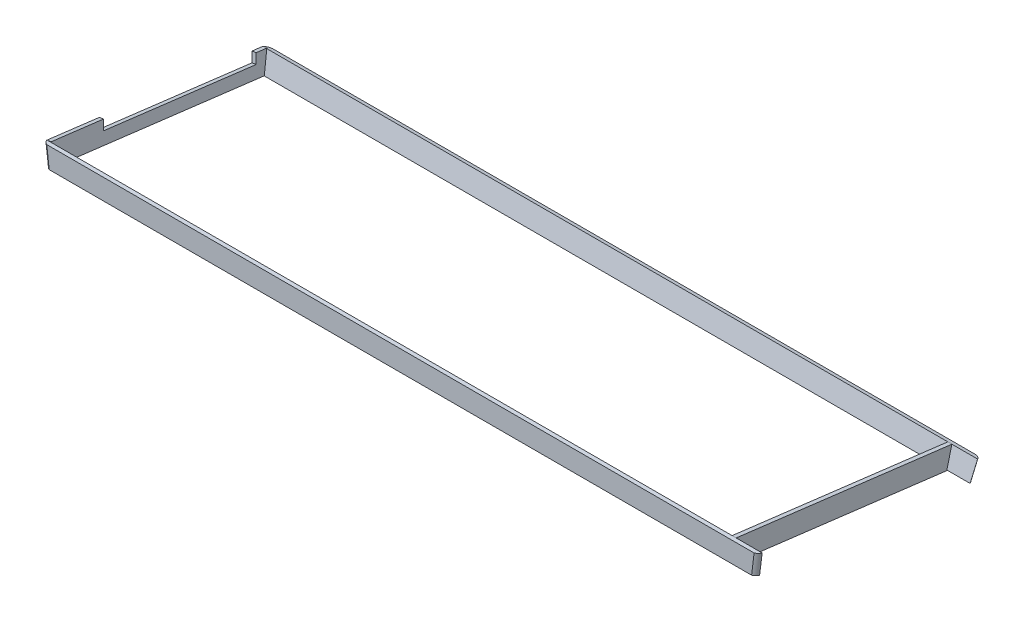
ISO-10303-21;
HEADER;
FILE_DESCRIPTION(('STEP AP214'),'2;1');
FILE_NAME('part.step','',(''),(''),'','','');
FILE_SCHEMA(('AUTOMOTIVE_DESIGN { 1 0 10303 214 1 1 1 1 }'));
ENDSEC;
DATA;
#1=APPLICATION_CONTEXT('core data for automotive mechanical design processes');
#2=APPLICATION_PROTOCOL_DEFINITION('international standard','automotive_design',2000,#1);
#3=PRODUCT_CONTEXT('',#1,'mechanical');
#4=PRODUCT('Part','Part','',(#3));
#5=PRODUCT_RELATED_PRODUCT_CATEGORY('part','',(#4));
#6=PRODUCT_DEFINITION_FORMATION('','',#4);
#7=PRODUCT_DEFINITION_CONTEXT('part definition',#1,'design');
#8=PRODUCT_DEFINITION('design','',#6,#7);
#9=PRODUCT_DEFINITION_SHAPE('','',#8);
#10=(LENGTH_UNIT() NAMED_UNIT(*) SI_UNIT(.MILLI.,.METRE.));
#11=(NAMED_UNIT(*) PLANE_ANGLE_UNIT() SI_UNIT($,.RADIAN.));
#12=(NAMED_UNIT(*) SI_UNIT($,.STERADIAN.) SOLID_ANGLE_UNIT());
#13=UNCERTAINTY_MEASURE_WITH_UNIT(LENGTH_MEASURE(1.E-05),#10,'distance_accuracy_value','');
#14=(GEOMETRIC_REPRESENTATION_CONTEXT(3) GLOBAL_UNCERTAINTY_ASSIGNED_CONTEXT((#13)) GLOBAL_UNIT_ASSIGNED_CONTEXT((#10,
#11,#12)) REPRESENTATION_CONTEXT('',''));
#15=CARTESIAN_POINT('',(0.,0.,0.));
#16=DIRECTION('',(0.,0.,1.));
#17=DIRECTION('',(1.,0.,0.));
#18=AXIS2_PLACEMENT_3D('',#15,#16,#17);
#19=CARTESIAN_POINT('',(2.22044604925031E-13,-68.0158170578648,-549.752872760666));
#20=DIRECTION('',(0.,0.243710985890071,0.969847903207761));
#21=DIRECTION('',(1.,0.,0.));
#22=AXIS2_PLACEMENT_3D('',#19,#20,#21);
#23=PLANE('',#22);
#24=DIRECTION('',(1.,0.,0.));
#25=VECTOR('',#24,1.);
#26=CARTESIAN_POINT('',(-881.492544306132,-178.869432394512,-521.896707073431));
#27=LINE('',#26,#25);
#28=CARTESIAN_POINT('',(-881.456949016877,-178.869432394512,-521.896707073431));
#29=VERTEX_POINT('',#28);
#30=CARTESIAN_POINT('',(876.247641689883,-178.869432394512,-521.896707073431));
#31=VERTEX_POINT('',#30);
#32=EDGE_CURVE('E49',#29,#31,#27,.T.);
#33=ORIENTED_EDGE('',*,*,#32,.T.);
#34=CARTESIAN_POINT('',(-296.789427030071,-9380.64778403381,1790.39831011703));
#35=DIRECTION('',(0.,0.243710985890071,0.969847903207761));
#36=DIRECTION('',(0.120974341833723,0.96272498568484,-0.241921083322686));
#37=AXIS2_PLACEMENT_3D('',#34,#35,#36);
#38=ELLIPSE('',#37,20533.7669945915,18.796);
#39=CARTESIAN_POINT('',(882.413697299898,-129.601158911557,-534.277225156647));
#40=VERTEX_POINT('',#39);
#41=EDGE_CURVE('E63',#31,#40,#38,.T.);
#42=ORIENTED_EDGE('',*,*,#41,.T.);
#43=DIRECTION('',(-1.,0.,0.));
#44=VECTOR('',#43,1.);
#45=CARTESIAN_POINT('',(887.73,-129.601158911557,-534.277225156647));
#46=LINE('',#45,#44);
#47=CARTESIAN_POINT('',(-887.623004626891,-129.601158911557,-534.277225156647));
#48=VERTEX_POINT('',#47);
#49=EDGE_CURVE('E109',#40,#48,#46,.T.);
#50=ORIENTED_EDGE('',*,*,#49,.T.);
#51=CARTESIAN_POINT('',(291.580119703276,-9380.64778403405,1790.39831011709));
#52=DIRECTION('',(0.,0.243710985890071,0.969847903207761));
#53=DIRECTION('',(-0.120974341833741,0.962724985684838,-0.241921083322685));
#54=AXIS2_PLACEMENT_3D('',#51,#52,#53);
#55=ELLIPSE('',#54,20533.7669945934,18.796);
#56=EDGE_CURVE('E81',#48,#29,#55,.T.);
#57=ORIENTED_EDGE('',*,*,#56,.T.);
#58=EDGE_LOOP('',(#33,#42,#50,#57));
#59=FACE_BOUND('',#58,.T.);
#60=ADVANCED_FACE('F45',(#59),#23,.T.);
#61=CARTESIAN_POINT('',(2.22044604925031E-13,-70.4529269167654,-559.451351792744));
#62=DIRECTION('',(0.,0.243710985890071,0.969847903207761));
#63=DIRECTION('',(1.,0.,0.));
#64=AXIS2_PLACEMENT_3D('',#61,#62,#63);
#65=PLANE('',#64);
#66=CARTESIAN_POINT('',(-1618.37801334505,-19900.4089276958,4423.57548274722));
#67=DIRECTION('',(0.,0.243710985890071,0.969847903207761));
#68=DIRECTION('',(0.120974341833723,0.96272498568484,-0.241921083322686));
#69=AXIS2_PLACEMENT_3D('',#66,#67,#68);
#70=ELLIPSE('',#69,20533.7669945915,18.796);
#71=CARTESIAN_POINT('',(860.823886031654,-181.306542253412,-531.595186105509));
#72=VERTEX_POINT('',#71);
#73=CARTESIAN_POINT('',(865.678837336204,-132.038268767054,-543.97570418958));
#74=VERTEX_POINT('',#73);
#75=EDGE_CURVE('E55',#72,#74,#70,.T.);
#76=ORIENTED_EDGE('',*,*,#75,.F.);
#77=DIRECTION('',(1.,0.,0.));
#78=VECTOR('',#77,1.);
#79=CARTESIAN_POINT('',(-881.492544306132,-181.306542253413,-531.595186105509));
#80=LINE('',#79,#78);
#81=CARTESIAN_POINT('',(-866.033193358654,-181.306542253413,-531.595186105509));
#82=VERTEX_POINT('',#81);
#83=EDGE_CURVE('E98',#82,#72,#80,.T.);
#84=ORIENTED_EDGE('',*,*,#83,.F.);
#85=CARTESIAN_POINT('',(1613.16870601856,-19900.408927697,4423.57548274752));
#86=DIRECTION('',(0.,0.243710985890071,0.969847903207761));
#87=DIRECTION('',(-0.120974341833741,0.962724985684838,-0.241921083322685));
#88=AXIS2_PLACEMENT_3D('',#85,#86,#87);
#89=ELLIPSE('',#88,20533.7669945934,18.796);
#90=CARTESIAN_POINT('',(-870.888144663335,-132.038268765971,-543.975704189851));
#91=VERTEX_POINT('',#90);
#92=EDGE_CURVE('E105',#91,#82,#89,.T.);
#93=ORIENTED_EDGE('',*,*,#92,.F.);
#94=DIRECTION('',(-1.,0.,0.));
#95=VECTOR('',#94,1.);
#96=CARTESIAN_POINT('',(887.73,-132.038268770458,-543.975704188724));
#97=LINE('',#96,#95);
#98=EDGE_CURVE('E100',#74,#91,#97,.T.);
#99=ORIENTED_EDGE('',*,*,#98,.F.);
#100=EDGE_LOOP('',(#76,#84,#93,#99));
#101=FACE_BOUND('',#100,.T.);
#102=ADVANCED_FACE('F96',(#101),#65,.F.);
#103=CARTESIAN_POINT('',(887.73,-129.601158911557,-534.277225156647));
#104=DIRECTION('',(0.,-0.969847903207761,0.243710985890071));
#105=DIRECTION('',(0.,-0.243710985890071,-0.969847903207761));
#106=AXIS2_PLACEMENT_3D('',#103,#104,#105);
#107=PLANE('',#106);
#108=CARTESIAN_POINT('',(865.680949648837,-127.457475132036,-525.746435249428));
#109=DIRECTION('',(0.,-0.969847903207761,0.243710985890071));
#110=DIRECTION('',(0.99997137412323,0.00184402326089202,0.00733829083047228));
#111=AXIS2_PLACEMENT_3D('',#108,#109,#110);
#112=ELLIPSE('',#111,18.935073979517,18.796);
#113=EDGE_CURVE('E12',#74,#40,#112,.T.);
#114=ORIENTED_EDGE('',*,*,#113,.F.);
#115=ORIENTED_EDGE('',*,*,#98,.T.);
#116=CARTESIAN_POINT('',(-870.890256975832,-127.457475132036,-525.746435249428));
#117=DIRECTION('',(0.,-0.969847903207761,0.243710985890071));
#118=DIRECTION('',(-0.99997137412323,0.00184402326089159,0.00733829083047056));
#119=AXIS2_PLACEMENT_3D('',#116,#117,#118);
#120=ELLIPSE('',#119,18.935073979517,18.796);
#121=EDGE_CURVE('E103',#48,#91,#120,.T.);
#122=ORIENTED_EDGE('',*,*,#121,.F.);
#123=ORIENTED_EDGE('',*,*,#49,.F.);
#124=EDGE_LOOP('',(#114,#115,#122,#123));
#125=FACE_BOUND('',#124,.T.);
#126=ADVANCED_FACE('F119',(#125),#107,.F.);
#127=CARTESIAN_POINT('',(-881.492544306132,-178.869432394512,-521.896707073431));
#128=DIRECTION('',(0.,0.969847903207761,-0.243710985890071));
#129=DIRECTION('',(-1.,0.,0.));
#130=AXIS2_PLACEMENT_3D('',#127,#128,#129);
#131=PLANE('',#130);
#132=CARTESIAN_POINT('',(859.48998437162,-176.737165225779,-513.41134957048));
#133=DIRECTION('',(0.,0.969847903207761,-0.243710985890071));
#134=DIRECTION('',(0.99997137412323,0.00184402326089225,0.00733829083047221));
#135=AXIS2_PLACEMENT_3D('',#132,#133,#134);
#136=ELLIPSE('',#135,18.935073979517,18.796);
#137=EDGE_CURVE('E83',#31,#72,#136,.T.);
#138=ORIENTED_EDGE('',*,*,#137,.F.);
#139=ORIENTED_EDGE('',*,*,#32,.F.);
#140=CARTESIAN_POINT('',(-864.699291698613,-176.73716522578,-513.411349570481));
#141=DIRECTION('',(0.,0.969847903207761,-0.243710985890071));
#142=DIRECTION('',(-0.99997137412323,0.00184402326089136,0.00733829083047063));
#143=AXIS2_PLACEMENT_3D('',#140,#141,#142);
#144=ELLIPSE('',#143,18.935073979517,18.796);
#145=EDGE_CURVE('E91',#82,#29,#144,.T.);
#146=ORIENTED_EDGE('',*,*,#145,.F.);
#147=ORIENTED_EDGE('',*,*,#83,.T.);
#148=EDGE_LOOP('',(#138,#139,#146,#147));
#149=FACE_BOUND('',#148,.T.);
#150=ADVANCED_FACE('F47',(#149),#131,.F.);
#151=CARTESIAN_POINT('',(-851.874778988612,-278.819471239961,-487.859362766299));
#152=DIRECTION('',(-0.120974291151364,0.962947668142679,-0.241033212024822));
#153=DIRECTION('',(0.,-0.242816543984105,-0.970072227191159));
#154=AXIS2_PLACEMENT_3D('',#151,#152,#153);
#155=CYLINDRICAL_SURFACE('',#154,18.796);
#156=ORIENTED_EDGE('',*,*,#121,.T.);
#157=ORIENTED_EDGE('',*,*,#92,.T.);
#158=ORIENTED_EDGE('',*,*,#145,.T.);
#159=ORIENTED_EDGE('',*,*,#56,.F.);
#160=EDGE_LOOP('',(#156,#157,#158,#159));
#161=FACE_BOUND('',#160,.T.);
#162=ADVANCED_FACE('F117',(#161),#155,.T.);
#163=CARTESIAN_POINT('',(864.433849686277,-137.384311565293,-523.261671694864));
#164=DIRECTION('',(0.120974291151346,0.962947668142681,-0.241033212024823));
#165=DIRECTION('',(0.992546151641323,-0.12094720057894,0.0149636738175255));
#166=AXIS2_PLACEMENT_3D('',#163,#164,#165);
#167=CYLINDRICAL_SURFACE('',#166,18.796);
#168=ORIENTED_EDGE('',*,*,#137,.T.);
#169=ORIENTED_EDGE('',*,*,#75,.T.);
#170=ORIENTED_EDGE('',*,*,#113,.T.);
#171=ORIENTED_EDGE('',*,*,#41,.F.);
#172=EDGE_LOOP('',(#168,#169,#170,#171));
#173=FACE_BOUND('',#172,.T.);
#174=ADVANCED_FACE('F85',(#173),#167,.T.);
#175=CLOSED_SHELL('',(#60,#102,#126,#150,#162,#174));
#176=MANIFOLD_SOLID_BREP('B2',#175);
#177=CARTESIAN_POINT('',(0.,0.,10.));
#178=DIRECTION('',(0.,0.,1.));
#179=DIRECTION('',(1.,0.,0.));
#180=AXIS2_PLACEMENT_3D('',#177,#178,#179);
#181=PLANE('',#180);
#182=DIRECTION('',(1.,0.,0.));
#183=VECTOR('',#182,1.);
#184=CARTESIAN_POINT('',(-881.492544306132,-114.3,10.));
#185=LINE('',#184,#183);
#186=CARTESIAN_POINT('',(-872.306440998005,-114.3,10.));
#187=VERTEX_POINT('',#186);
#188=CARTESIAN_POINT('',(867.097133671005,-114.3,10.));
#189=VERTEX_POINT('',#188);
#190=EDGE_CURVE('E182',#187,#189,#185,.T.);
#191=ORIENTED_EDGE('',*,*,#190,.T.);
#192=CARTESIAN_POINT('',(-1413.85249724018,-18768.0329043244,10.));
#193=DIRECTION('',(0.,0.,1.));
#194=DIRECTION('',(0.120974341833724,0.992655634456329,0.));
#195=AXIS2_PLACEMENT_3D('',#192,#193,#194);
#196=ELLIPSE('',#195,20533.7669943114,18.796);
#197=CARTESIAN_POINT('',(873.180039228705,-63.4999999999998,10.));
#198=VERTEX_POINT('',#197);
#199=EDGE_CURVE('E256',#189,#198,#196,.T.);
#200=ORIENTED_EDGE('',*,*,#199,.T.);
#201=DIRECTION('',(-1.,0.,0.));
#202=VECTOR('',#201,1.);
#203=CARTESIAN_POINT('',(887.73,-63.4999999999998,10.));
#204=LINE('',#203,#202);
#205=CARTESIAN_POINT('',(-878.389346555706,-63.4999999999998,10.));
#206=VERTEX_POINT('',#205);
#207=EDGE_CURVE('E257',#198,#206,#204,.T.);
#208=ORIENTED_EDGE('',*,*,#207,.T.);
#209=CARTESIAN_POINT('',(1408.64318991419,-18768.03290433,10.));
#210=DIRECTION('',(0.,0.,1.));
#211=DIRECTION('',(-0.120974341833741,0.992655634456327,0.));
#212=AXIS2_PLACEMENT_3D('',#209,#210,#211);
#213=ELLIPSE('',#212,20533.7669943213,18.796);
#214=EDGE_CURVE('E260',#206,#187,#213,.T.);
#215=ORIENTED_EDGE('',*,*,#214,.T.);
#216=EDGE_LOOP('',(#191,#200,#208,#215));
#217=FACE_BOUND('',#216,.T.);
#218=ADVANCED_FACE('F178',(#217),#181,.T.);
#219=CARTESIAN_POINT('',(0.,0.,0.));
#220=DIRECTION('',(0.,0.,1.));
#221=DIRECTION('',(1.,0.,0.));
#222=AXIS2_PLACEMENT_3D('',#219,#220,#221);
#223=PLANE('',#222);
#224=CARTESIAN_POINT('',(-92.2639109432348,-7923.73041228038,0.));
#225=DIRECTION('',(0.,0.,1.));
#226=DIRECTION('',(0.120974341833724,0.992655634456329,0.));
#227=AXIS2_PLACEMENT_3D('',#224,#225,#226);
#228=ELLIPSE('',#227,20533.7669943114,18.796);
#229=CARTESIAN_POINT('',(876.956014817047,-114.3,0.));
#230=VERTEX_POINT('',#229);
#231=CARTESIAN_POINT('',(883.127325743308,-63.4999999999998,0.));
#232=VERTEX_POINT('',#231);
#233=EDGE_CURVE('E215',#230,#232,#228,.T.);
#234=ORIENTED_EDGE('',*,*,#233,.F.);
#235=DIRECTION('',(1.,0.,0.));
#236=VECTOR('',#235,1.);
#237=CARTESIAN_POINT('',(-881.492544306132,-114.3,0.));
#238=LINE('',#237,#236);
#239=CARTESIAN_POINT('',(-881.492544306132,-114.3,0.));
#240=VERTEX_POINT('',#239);
#241=EDGE_CURVE('E232',#240,#230,#238,.T.);
#242=ORIENTED_EDGE('',*,*,#241,.F.);
#243=DIRECTION('',(0.121869343405147,-0.992546151641322,0.));
#244=VECTOR('',#243,1.);
#245=CARTESIAN_POINT('',(-881.492544306132,-114.3,0.));
#246=LINE('',#245,#244);
#247=CARTESIAN_POINT('',(-887.73,-63.4999999999998,0.));
#248=VERTEX_POINT('',#247);
#249=EDGE_CURVE('E242',#248,#240,#246,.T.);
#250=ORIENTED_EDGE('',*,*,#249,.F.);
#251=DIRECTION('',(-1.,0.,0.));
#252=VECTOR('',#251,1.);
#253=CARTESIAN_POINT('',(887.73,-63.4999999999998,0.));
#254=LINE('',#253,#252);
#255=EDGE_CURVE('E237',#232,#248,#254,.T.);
#256=ORIENTED_EDGE('',*,*,#255,.F.);
#257=EDGE_LOOP('',(#234,#242,#250,#256));
#258=FACE_BOUND('',#257,.T.);
#259=ADVANCED_FACE('F180',(#258),#223,.F.);
#260=CARTESIAN_POINT('',(887.73,-63.4999999999998,10.));
#261=DIRECTION('',(0.,-1.,0.));
#262=DIRECTION('',(0.,0.,-1.));
#263=AXIS2_PLACEMENT_3D('',#260,#261,#262);
#264=PLANE('',#263);
#265=CARTESIAN_POINT('',(865.657615697604,-63.4999999999998,-7.24825816879146));
#266=DIRECTION('',(0.,-1.,0.));
#267=DIRECTION('',(0.999971374123229,0.,-0.0075664347020817));
#268=AXIS2_PLACEMENT_3D('',#265,#266,#267);
#269=ELLIPSE('',#268,18.935073979517,18.796);
#270=EDGE_CURVE('E210',#232,#198,#269,.T.);
#271=ORIENTED_EDGE('',*,*,#270,.F.);
#272=ORIENTED_EDGE('',*,*,#255,.T.);
#273=DIRECTION('',(0.,0.,-1.));
#274=VECTOR('',#273,1.);
#275=CARTESIAN_POINT('',(-887.73,-63.4999999999998,10.));
#276=LINE('',#275,#274);
#277=CARTESIAN_POINT('',(-887.73,-63.4999999999998,1.29902125661314));
#278=VERTEX_POINT('',#277);
#279=EDGE_CURVE('E243',#278,#248,#276,.T.);
#280=ORIENTED_EDGE('',*,*,#279,.F.);
#281=CARTESIAN_POINT('',(-870.866923024597,-63.4999999999998,-7.24825816878839));
#282=DIRECTION('',(0.,-1.,0.));
#283=DIRECTION('',(-0.999971374123229,0.,-0.00756643470207701));
#284=AXIS2_PLACEMENT_3D('',#281,#282,#283);
#285=ELLIPSE('',#284,18.935073979517,18.796);
#286=EDGE_CURVE('E43',#206,#278,#285,.T.);
#287=ORIENTED_EDGE('',*,*,#286,.F.);
#288=ORIENTED_EDGE('',*,*,#207,.F.);
#289=EDGE_LOOP('',(#271,#272,#280,#287,#288));
#290=FACE_BOUND('',#289,.T.);
#291=ADVANCED_FACE('F269',(#290),#264,.F.);
#292=CARTESIAN_POINT('',(-881.492544306132,-114.3,10.));
#293=DIRECTION('',(0.,1.,0.));
#294=DIRECTION('',(-1.,0.,0.));
#295=AXIS2_PLACEMENT_3D('',#292,#293,#294);
#296=PLANE('',#295);
#297=CARTESIAN_POINT('',(859.466650420387,-114.3,-7.20141329330291));
#298=DIRECTION('',(0.,1.,0.));
#299=DIRECTION('',(0.999971374123229,0.,-0.00756643470208168));
#300=AXIS2_PLACEMENT_3D('',#297,#298,#299);
#301=ELLIPSE('',#300,18.935073979517,18.796);
#302=EDGE_CURVE('E219',#189,#230,#301,.T.);
#303=ORIENTED_EDGE('',*,*,#302,.F.);
#304=ORIENTED_EDGE('',*,*,#190,.F.);
#305=CARTESIAN_POINT('',(-864.675957747379,-114.3,-7.20141329329986));
#306=DIRECTION('',(0.,1.,0.));
#307=DIRECTION('',(-0.999971374123229,0.,-0.00756643470207702));
#308=AXIS2_PLACEMENT_3D('',#305,#306,#307);
#309=ELLIPSE('',#308,18.935073979517,18.796);
#310=CARTESIAN_POINT('',(-881.492544306132,-114.3,1.43563523381322));
#311=VERTEX_POINT('',#310);
#312=EDGE_CURVE('E188',#311,#187,#309,.T.);
#313=ORIENTED_EDGE('',*,*,#312,.F.);
#314=DIRECTION('',(0.,0.,-1.));
#315=VECTOR('',#314,1.);
#316=CARTESIAN_POINT('',(-881.492544306132,-114.3,10.));
#317=LINE('',#316,#315);
#318=EDGE_CURVE('E229',#311,#240,#317,.T.);
#319=ORIENTED_EDGE('',*,*,#318,.T.);
#320=ORIENTED_EDGE('',*,*,#241,.T.);
#321=EDGE_LOOP('',(#303,#304,#313,#319,#320));
#322=FACE_BOUND('',#321,.T.);
#323=ADVANCED_FACE('F231',(#322),#296,.F.);
#324=CARTESIAN_POINT('',(-881.492544306132,-114.3,10.));
#325=DIRECTION('',(0.992546151641322,0.121869343405147,0.));
#326=DIRECTION('',(-0.121869343405147,0.992546151641322,0.));
#327=AXIS2_PLACEMENT_3D('',#324,#325,#326);
#328=PLANE('',#327);
#329=CARTESIAN_POINT('',(1374.72972991579,-18489.7558197761,9.74338867367638));
#330=DIRECTION('',(0.992546151641322,0.121869343405147,0.));
#331=DIRECTION('',(-0.121869292347766,0.992545735812324,-0.00091537065000802));
#332=AXIS2_PLACEMENT_3D('',#329,#330,#331);
#333=ELLIPSE('',#332,20845.7041755421,18.796);
#334=EDGE_CURVE('E253',#278,#311,#333,.T.);
#335=ORIENTED_EDGE('',*,*,#334,.F.);
#336=ORIENTED_EDGE('',*,*,#279,.T.);
#337=ORIENTED_EDGE('',*,*,#249,.T.);
#338=ORIENTED_EDGE('',*,*,#318,.F.);
#339=EDGE_LOOP('',(#335,#336,#337,#338));
#340=FACE_BOUND('',#339,.T.);
#341=ADVANCED_FACE('F245',(#340),#328,.F.);
#342=CARTESIAN_POINT('',(872.87197063104,-4.30257048650858,-7.30284667695685));
#343=DIRECTION('',(0.120974291151346,0.992655218581801,-0.000915370277904057));
#344=DIRECTION('',(0.,-0.000922142826207298,-0.999999574826214));
#345=AXIS2_PLACEMENT_3D('',#342,#343,#344);
#346=CYLINDRICAL_SURFACE('',#345,18.796);
#347=ORIENTED_EDGE('',*,*,#302,.T.);
#348=ORIENTED_EDGE('',*,*,#233,.T.);
#349=ORIENTED_EDGE('',*,*,#270,.T.);
#350=ORIENTED_EDGE('',*,*,#199,.F.);
#351=EDGE_LOOP('',(#347,#348,#349,#350));
#352=FACE_BOUND('',#351,.T.);
#353=ADVANCED_FACE('F282',(#352),#346,.T.);
#354=CARTESIAN_POINT('',(-878.081277958032,-4.30257048652353,-7.30284667695375));
#355=DIRECTION('',(-0.120974291151363,0.992655218581799,-0.000915370277903618));
#356=DIRECTION('',(0.992546151641321,0.120947200578957,-0.0149636738175293));
#357=AXIS2_PLACEMENT_3D('',#354,#355,#356);
#358=CYLINDRICAL_SURFACE('',#357,18.796);
#359=ORIENTED_EDGE('',*,*,#334,.T.);
#360=ORIENTED_EDGE('',*,*,#312,.T.);
#361=ORIENTED_EDGE('',*,*,#214,.F.);
#362=ORIENTED_EDGE('',*,*,#286,.T.);
#363=EDGE_LOOP('',(#359,#360,#361,#362));
#364=FACE_BOUND('',#363,.T.);
#365=ADVANCED_FACE('F267',(#364),#358,.T.);
#366=CLOSED_SHELL('',(#218,#259,#291,#323,#341,#353,#365));
#367=MANIFOLD_SOLID_BREP('B6',#366);
#368=CARTESIAN_POINT('',(818.753886540204,-129.601158911558,-534.277225156647));
#369=DIRECTION('',(0.,-0.992433348695962,0.122784560902904));
#370=DIRECTION('',(0.,-0.122784560902904,-0.992433348695962));
#371=AXIS2_PLACEMENT_3D('',#368,#369,#370);
#372=PLANE('',#371);
#373=DIRECTION('',(0.,0.122784560902904,0.992433348695962));
#374=VECTOR('',#373,1.);
#375=CARTESIAN_POINT('',(808.753886540204,-129.601158911558,-534.277225156647));
#376=LINE('',#375,#374);
#377=CARTESIAN_POINT('',(808.753886540204,-129.601158911558,-534.277225156647));
#378=VERTEX_POINT('',#377);
#379=CARTESIAN_POINT('',(808.753886540204,-63.5000000000003,-4.44089209850063E-13));
#380=VERTEX_POINT('',#379);
#381=EDGE_CURVE('E400',#378,#380,#376,.T.);
#382=ORIENTED_EDGE('',*,*,#381,.T.);
#383=DIRECTION('',(-1.,0.,0.));
#384=VECTOR('',#383,1.);
#385=CARTESIAN_POINT('',(818.753886540204,-63.5000000000003,-4.44089209850063E-13));
#386=LINE('',#385,#384);
#387=CARTESIAN_POINT('',(818.753886540204,-63.5000000000003,-4.44089209850063E-13));
#388=VERTEX_POINT('',#387);
#389=EDGE_CURVE('E176',#388,#380,#386,.T.);
#390=ORIENTED_EDGE('',*,*,#389,.F.);
#391=DIRECTION('',(0.,0.122784560902904,0.992433348695962));
#392=VECTOR('',#391,1.);
#393=CARTESIAN_POINT('',(818.753886540204,-129.601158911558,-534.277225156647));
#394=LINE('',#393,#392);
#395=CARTESIAN_POINT('',(818.753886540204,-129.601158911558,-534.277225156647));
#396=VERTEX_POINT('',#395);
#397=EDGE_CURVE('E388',#396,#388,#394,.T.);
#398=ORIENTED_EDGE('',*,*,#397,.F.);
#399=DIRECTION('',(-1.,0.,0.));
#400=VECTOR('',#399,1.);
#401=CARTESIAN_POINT('',(818.753886540204,-129.601158911558,-534.277225156647));
#402=LINE('',#401,#400);
#403=EDGE_CURVE('E396',#396,#378,#402,.T.);
#404=ORIENTED_EDGE('',*,*,#403,.T.);
#405=EDGE_LOOP('',(#382,#390,#398,#404));
#406=FACE_BOUND('',#405,.T.);
#407=ADVANCED_FACE('F337',(#406),#372,.F.);
#408=CARTESIAN_POINT('',(818.753886540204,-63.5000000000003,-4.44089209850063E-13));
#409=DIRECTION('',(0.,-0.000922142826199165,-0.999999574826214));
#410=DIRECTION('',(0.,0.999999574826214,-0.000922142826199165));
#411=AXIS2_PLACEMENT_3D('',#408,#409,#410);
#412=PLANE('',#411);
#413=DIRECTION('',(0.,-0.999999574826214,0.000922142826199179));
#414=VECTOR('',#413,1.);
#415=CARTESIAN_POINT('',(808.753886540204,-63.5000000000003,-4.44089209850063E-13));
#416=LINE('',#415,#414);
#417=CARTESIAN_POINT('',(808.753886540204,-115.548043650694,0.04799575047576));
#418=VERTEX_POINT('',#417);
#419=EDGE_CURVE('E392',#380,#418,#416,.T.);
#420=ORIENTED_EDGE('',*,*,#419,.T.);
#421=DIRECTION('',(-1.,0.,0.));
#422=VECTOR('',#421,1.);
#423=CARTESIAN_POINT('',(818.753886540204,-115.548043650694,0.04799575047576));
#424=LINE('',#423,#422);
#425=CARTESIAN_POINT('',(818.753886540204,-115.548043650694,0.04799575047576));
#426=VERTEX_POINT('',#425);
#427=EDGE_CURVE('E345',#426,#418,#424,.T.);
#428=ORIENTED_EDGE('',*,*,#427,.F.);
#429=DIRECTION('',(0.,-0.999999574826214,0.000922142826199179));
#430=VECTOR('',#429,1.);
#431=CARTESIAN_POINT('',(818.753886540204,-63.5000000000003,-4.44089209850063E-13));
#432=LINE('',#431,#430);
#433=EDGE_CURVE('E383',#388,#426,#432,.T.);
#434=ORIENTED_EDGE('',*,*,#433,.F.);
#435=ORIENTED_EDGE('',*,*,#389,.T.);
#436=EDGE_LOOP('',(#420,#428,#434,#435));
#437=FACE_BOUND('',#436,.T.);
#438=ADVANCED_FACE('F391',(#437),#412,.F.);
#439=CARTESIAN_POINT('',(818.753886540204,-115.548043650694,0.04799575047576));
#440=DIRECTION('',(0.,0.992433348695962,-0.122784560902904));
#441=DIRECTION('',(1.,0.,0.));
#442=AXIS2_PLACEMENT_3D('',#439,#440,#441);
#443=PLANE('',#442);
#444=DIRECTION('',(0.,-0.122784560902904,-0.992433348695962));
#445=VECTOR('',#444,1.);
#446=CARTESIAN_POINT('',(808.753886540204,-115.548043650694,0.04799575047576));
#447=LINE('',#446,#445);
#448=CARTESIAN_POINT('',(808.753886540204,-180.091542003916,-521.639093702851));
#449=VERTEX_POINT('',#448);
#450=EDGE_CURVE('E370',#418,#449,#447,.T.);
#451=ORIENTED_EDGE('',*,*,#450,.T.);
#452=DIRECTION('',(-1.,0.,0.));
#453=VECTOR('',#452,1.);
#454=CARTESIAN_POINT('',(818.753886540204,-180.091542003916,-521.639093702851));
#455=LINE('',#454,#453);
#456=CARTESIAN_POINT('',(818.753886540204,-180.091542003916,-521.639093702851));
#457=VERTEX_POINT('',#456);
#458=EDGE_CURVE('E393',#457,#449,#455,.T.);
#459=ORIENTED_EDGE('',*,*,#458,.F.);
#460=DIRECTION('',(0.,-0.122784560902904,-0.992433348695962));
#461=VECTOR('',#460,1.);
#462=CARTESIAN_POINT('',(818.753886540204,-115.548043650694,0.04799575047576));
#463=LINE('',#462,#461);
#464=EDGE_CURVE('E386',#426,#457,#463,.T.);
#465=ORIENTED_EDGE('',*,*,#464,.F.);
#466=ORIENTED_EDGE('',*,*,#427,.T.);
#467=EDGE_LOOP('',(#451,#459,#465,#466));
#468=FACE_BOUND('',#467,.T.);
#469=ADVANCED_FACE('F394',(#468),#443,.F.);
#470=CARTESIAN_POINT('',(818.753886540204,-129.601158911558,-534.277225156647));
#471=DIRECTION('',(0.,0.242816543984096,0.970072227191161));
#472=DIRECTION('',(0.,-0.970072227191161,0.242816543984096));
#473=AXIS2_PLACEMENT_3D('',#470,#471,#472);
#474=PLANE('',#473);
#475=DIRECTION('',(0.,0.970072227191161,-0.242816543984096));
#476=VECTOR('',#475,1.);
#477=CARTESIAN_POINT('',(808.753886540204,-129.601158911558,-534.277225156647));
#478=LINE('',#477,#476);
#479=EDGE_CURVE('E376',#449,#378,#478,.T.);
#480=ORIENTED_EDGE('',*,*,#479,.T.);
#481=ORIENTED_EDGE('',*,*,#403,.F.);
#482=DIRECTION('',(0.,0.970072227191161,-0.242816543984096));
#483=VECTOR('',#482,1.);
#484=CARTESIAN_POINT('',(818.753886540204,-129.601158911558,-534.277225156647));
#485=LINE('',#484,#483);
#486=EDGE_CURVE('E353',#457,#396,#485,.T.);
#487=ORIENTED_EDGE('',*,*,#486,.F.);
#488=ORIENTED_EDGE('',*,*,#458,.T.);
#489=EDGE_LOOP('',(#480,#481,#487,#488));
#490=FACE_BOUND('',#489,.T.);
#491=ADVANCED_FACE('F407',(#490),#474,.F.);
#492=CARTESIAN_POINT('',(818.753886540204,-34.3846610713561,-274.829824287389));
#493=DIRECTION('',(1.,0.,0.));
#494=DIRECTION('',(0.,-0.122784560902904,-0.992433348695962));
#495=AXIS2_PLACEMENT_3D('',#492,#493,#494);
#496=PLANE('',#495);
#497=ORIENTED_EDGE('',*,*,#397,.T.);
#498=ORIENTED_EDGE('',*,*,#433,.T.);
#499=ORIENTED_EDGE('',*,*,#464,.T.);
#500=ORIENTED_EDGE('',*,*,#486,.T.);
#501=EDGE_LOOP('',(#497,#498,#499,#500));
#502=FACE_BOUND('',#501,.T.);
#503=ADVANCED_FACE('F384',(#502),#496,.T.);
#504=CARTESIAN_POINT('',(808.753886540204,-34.3846610713561,-274.829824287389));
#505=DIRECTION('',(1.,0.,0.));
#506=DIRECTION('',(0.,-0.122784560902904,-0.992433348695962));
#507=AXIS2_PLACEMENT_3D('',#504,#505,#506);
#508=PLANE('',#507);
#509=ORIENTED_EDGE('',*,*,#381,.F.);
#510=ORIENTED_EDGE('',*,*,#479,.F.);
#511=ORIENTED_EDGE('',*,*,#450,.F.);
#512=ORIENTED_EDGE('',*,*,#419,.F.);
#513=EDGE_LOOP('',(#509,#510,#511,#512));
#514=FACE_BOUND('',#513,.T.);
#515=ADVANCED_FACE('F410',(#514),#508,.F.);
#516=CLOSED_SHELL('',(#407,#438,#469,#491,#503,#515));
#517=MANIFOLD_SOLID_BREP('B37',#516);
#518=CARTESIAN_POINT('',(-887.73,-63.4999999999998,0.));
#519=DIRECTION('',(0.122784560902904,-0.984923951603881,0.121855492945033));
#520=DIRECTION('',(0.,0.122784560902904,0.992433348695962));
#521=AXIS2_PLACEMENT_3D('',#518,#519,#520);
#522=PLANE('',#521);
#523=DIRECTION('',(0.,-0.122784560902904,-0.992433348695962));
#524=VECTOR('',#523,1.);
#525=CARTESIAN_POINT('',(-887.73,-63.4999999999998,0.));
#526=LINE('',#525,#524);
#527=CARTESIAN_POINT('',(-887.73,-126.326494672277,-507.809027746925));
#528=VERTEX_POINT('',#527);
#529=CARTESIAN_POINT('',(-887.73,-129.575226370299,-534.067619660877));
#530=VERTEX_POINT('',#529);
#531=EDGE_CURVE('E575',#528,#530,#526,.T.);
#532=ORIENTED_EDGE('',*,*,#531,.F.);
#533=DIRECTION('',(-0.992433348695962,-0.121855492945033,0.015076048396119));
#534=VECTOR('',#533,1.);
#535=CARTESIAN_POINT('',(-877.80566651304,-125.107939742826,-507.959788230886));
#536=LINE('',#535,#534);
#537=CARTESIAN_POINT('',(-877.80566651304,-125.107939742826,-507.959788230886));
#538=VERTEX_POINT('',#537);
#539=EDGE_CURVE('E560',#538,#528,#536,.T.);
#540=ORIENTED_EDGE('',*,*,#539,.F.);
#541=DIRECTION('',(0.,-0.122784560902904,-0.992433348695962));
#542=VECTOR('',#541,1.);
#543=CARTESIAN_POINT('',(-877.80566651304,-62.2814450705495,-0.150760483961232));
#544=LINE('',#543,#542);
#545=CARTESIAN_POINT('',(-877.80566651304,-128.382603982107,-534.427985640608));
#546=VERTEX_POINT('',#545);
#547=EDGE_CURVE('E551',#538,#546,#544,.T.);
#548=ORIENTED_EDGE('',*,*,#547,.T.);
#549=DIRECTION('',(0.992433348695962,0.121855492945032,-0.015076048396119));
#550=VECTOR('',#549,1.);
#551=CARTESIAN_POINT('',(-887.73,-129.601158911557,-534.277225156647));
#552=LINE('',#551,#550);
#553=CARTESIAN_POINT('',(-887.625410980983,-129.588316994782,-534.278813967739));
#554=VERTEX_POINT('',#553);
#555=EDGE_CURVE('E468',#554,#546,#552,.T.);
#556=ORIENTED_EDGE('',*,*,#555,.F.);
#557=CARTESIAN_POINT('',(-871.011616781876,-126.491458789849,-525.988236574182));
#558=DIRECTION('',(0.122784560902904,-0.984923951603881,0.121855492945033));
#559=DIRECTION('',(0.00750918212892397,-0.121859034456755,-0.992519011356973));
#560=AXIS2_PLACEMENT_3D('',#557,#558,#559);
#561=ELLIPSE('',#560,18.935073979517,18.796);
#562=EDGE_CURVE('E569',#530,#554,#561,.T.);
#563=ORIENTED_EDGE('',*,*,#562,.F.);
#564=EDGE_LOOP('',(#532,#540,#548,#556,#563));
#565=FACE_BOUND('',#564,.T.);
#566=ADVANCED_FACE('F460',(#565),#522,.F.);
#567=CARTESIAN_POINT('',(-877.80566651304,-62.2814450705495,-0.150760483961232));
#568=VERTEX_POINT('',#567);
#569=CARTESIAN_POINT('',(-877.80566651304,-78.32702203882,-129.842682377725));
#570=VERTEX_POINT('',#569);
#571=EDGE_CURVE('E580',#568,#570,#544,.T.);
#572=ORIENTED_EDGE('',*,*,#571,.T.);
#573=DIRECTION('',(-0.992433348695962,-0.121855492945033,0.015076048396119));
#574=VECTOR('',#573,1.);
#575=CARTESIAN_POINT('',(-877.80566651304,-78.32702203882,-129.842682377725));
#576=LINE('',#575,#574);
#577=CARTESIAN_POINT('',(-887.73,-79.5455769682703,-129.691921893764));
#578=VERTEX_POINT('',#577);
#579=EDGE_CURVE('E562',#570,#578,#576,.T.);
#580=ORIENTED_EDGE('',*,*,#579,.T.);
#581=CARTESIAN_POINT('',(-887.73,-63.4999999999998,0.));
#582=VERTEX_POINT('',#581);
#583=EDGE_CURVE('E571',#582,#578,#526,.T.);
#584=ORIENTED_EDGE('',*,*,#583,.F.);
#585=DIRECTION('',(0.992433348695962,0.121855492945032,-0.015076048396119));
#586=VECTOR('',#585,1.);
#587=CARTESIAN_POINT('',(-887.73,-63.4999999999998,0.));
#588=LINE('',#587,#586);
#589=EDGE_CURVE('E579',#582,#568,#588,.T.);
#590=ORIENTED_EDGE('',*,*,#589,.T.);
#591=EDGE_LOOP('',(#572,#580,#584,#590));
#592=FACE_BOUND('',#591,.T.);
#593=ADVANCED_FACE('F462',(#592),#522,.F.);
#594=CARTESIAN_POINT('',(-887.73,-129.601158911557,-534.277225156647));
#595=DIRECTION('',(-0.0149636738175261,0.241901378691115,0.970185452093166));
#596=DIRECTION('',(-0.121869343405147,0.96261880400627,-0.241894401157896));
#597=AXIS2_PLACEMENT_3D('',#594,#595,#596);
#598=PLANE('',#597);
#599=CARTESIAN_POINT('',(275.297701359683,-9251.04076896943,1757.9566768119));
#600=DIRECTION('',(-0.0149636738175261,0.241901378691115,0.970185452093166));
#601=DIRECTION('',(-0.120960847988298,0.96272994365717,-0.241908099988021));
#602=AXIS2_PLACEMENT_3D('',#599,#600,#601);
#603=ELLIPSE('',#602,20845.7041755584,18.796);
#604=CARTESIAN_POINT('',(-881.353320122489,-179.69947818409,-521.687600117942));
#605=VERTEX_POINT('',#604);
#606=EDGE_CURVE('E567',#554,#605,#603,.T.);
#607=ORIENTED_EDGE('',*,*,#606,.F.);
#608=ORIENTED_EDGE('',*,*,#555,.T.);
#609=DIRECTION('',(0.121869343405147,-0.96261880400627,0.241894401157896));
#610=VECTOR('',#609,1.);
#611=CARTESIAN_POINT('',(-877.80566651304,-128.382603982107,-534.427985640608));
#612=LINE('',#611,#610);
#613=CARTESIAN_POINT('',(-871.462602910904,-178.48505081425,-521.837849937287));
#614=VERTEX_POINT('',#613);
#615=EDGE_CURVE('E583',#546,#614,#612,.T.);
#616=ORIENTED_EDGE('',*,*,#615,.T.);
#617=DIRECTION('',(0.992433348695962,0.121855492945032,-0.015076048396119));
#618=VECTOR('',#617,1.);
#619=CARTESIAN_POINT('',(-881.386936397863,-179.703605743701,-521.687089453326));
#620=LINE('',#619,#618);
#621=EDGE_CURVE('E595',#605,#614,#620,.T.);
#622=ORIENTED_EDGE('',*,*,#621,.F.);
#623=EDGE_LOOP('',(#607,#608,#616,#622));
#624=FACE_BOUND('',#623,.T.);
#625=ADVANCED_FACE('F600',(#624),#598,.F.);
#626=CARTESIAN_POINT('',(-881.386936397863,-179.703605743701,-521.687089453326));
#627=DIRECTION('',(-0.122784560902904,0.984923951603881,-0.121855492945033));
#628=DIRECTION('',(-0.992433348695962,-0.121855492945032,0.015076048396119));
#629=AXIS2_PLACEMENT_3D('',#626,#627,#628);
#630=PLANE('',#629);
#631=CARTESIAN_POINT('',(-864.715830737155,-176.605515530248,-513.444302502427));
#632=DIRECTION('',(-0.122784560902904,0.984923951603881,-0.121855492945033));
#633=DIRECTION('',(0.00750918212892397,-0.121859034456755,-0.992519011356973));
#634=AXIS2_PLACEMENT_3D('',#631,#632,#633);
#635=ELLIPSE('',#634,18.935073979517,18.796);
#636=CARTESIAN_POINT('',(-881.386936397863,-179.695300510707,-521.619960572211));
#637=VERTEX_POINT('',#636);
#638=EDGE_CURVE('E483',#605,#637,#635,.T.);
#639=ORIENTED_EDGE('',*,*,#638,.F.);
#640=ORIENTED_EDGE('',*,*,#621,.T.);
#641=DIRECTION('',(0.,0.122784560902904,0.992433348695962));
#642=VECTOR('',#641,1.);
#643=CARTESIAN_POINT('',(-871.462602910904,-178.48505081425,-521.837849937287));
#644=LINE('',#643,#642);
#645=CARTESIAN_POINT('',(-871.462602910904,-113.941552461028,-0.150760483961121));
#646=VERTEX_POINT('',#645);
#647=EDGE_CURVE('E586',#614,#646,#644,.T.);
#648=ORIENTED_EDGE('',*,*,#647,.T.);
#649=DIRECTION('',(0.992433348695962,0.121855492945032,-0.015076048396119));
#650=VECTOR('',#649,1.);
#651=CARTESIAN_POINT('',(-881.386936397863,-115.160107390478,1.11022302462516E-13));
#652=LINE('',#651,#650);
#653=CARTESIAN_POINT('',(-881.386936397863,-115.160107390478,1.11022302462516E-13));
#654=VERTEX_POINT('',#653);
#655=EDGE_CURVE('E592',#654,#646,#652,.T.);
#656=ORIENTED_EDGE('',*,*,#655,.F.);
#657=DIRECTION('',(0.,0.122784560902904,0.992433348695962));
#658=VECTOR('',#657,1.);
#659=CARTESIAN_POINT('',(-881.386936397863,-179.703605743701,-521.687089453326));
#660=LINE('',#659,#658);
#661=EDGE_CURVE('E574',#637,#654,#660,.T.);
#662=ORIENTED_EDGE('',*,*,#661,.F.);
#663=EDGE_LOOP('',(#639,#640,#648,#656,#662));
#664=FACE_BOUND('',#663,.T.);
#665=ADVANCED_FACE('F609',(#664),#630,.F.);
#666=CARTESIAN_POINT('',(-895.421211709065,-34.8550488987659,-274.77162757028));
#667=DIRECTION('',(-0.992433348695962,-0.121855492945032,0.015076048396119));
#668=DIRECTION('',(0.,0.122784560902904,0.992433348695962));
#669=AXIS2_PLACEMENT_3D('',#666,#667,#668);
#670=PLANE('',#669);
#671=DIRECTION('',(0.122784560902906,-0.984923951603881,0.121855492945028));
#672=VECTOR('',#671,1.);
#673=CARTESIAN_POINT('',(-887.73,-126.326494672277,-507.809027746925));
#674=LINE('',#673,#672);
#675=CARTESIAN_POINT('',(-884.92314493776,-148.841856205942,-505.023411178202));
#676=VERTEX_POINT('',#675);
#677=EDGE_CURVE('E537',#528,#676,#674,.T.);
#678=ORIENTED_EDGE('',*,*,#677,.F.);
#679=ORIENTED_EDGE('',*,*,#531,.T.);
#680=CARTESIAN_POINT('',(1355.31667739432,-17847.9231695544,3909.8225018877));
#681=DIRECTION('',(-0.992433348695962,-0.121855492945032,0.015076048396119));
#682=DIRECTION('',(-0.121882786204514,0.96283652862801,-0.241019512833689));
#683=AXIS2_PLACEMENT_3D('',#680,#681,#682);
#684=ELLIPSE('',#683,20533.7669947244,18.796);
#685=EDGE_CURVE('E335',#530,#637,#684,.T.);
#686=ORIENTED_EDGE('',*,*,#685,.T.);
#687=ORIENTED_EDGE('',*,*,#661,.T.);
#688=DIRECTION('',(-0.121869343405147,0.992546151641322,0.));
#689=VECTOR('',#688,1.);
#690=CARTESIAN_POINT('',(-887.73,-63.4999999999998,0.));
#691=LINE('',#690,#689);
#692=EDGE_CURVE('E577',#654,#582,#691,.T.);
#693=ORIENTED_EDGE('',*,*,#692,.T.);
#694=ORIENTED_EDGE('',*,*,#583,.T.);
#695=DIRECTION('',(-0.122784560902902,0.984923951603881,-0.121855492945033));
#696=VECTOR('',#695,1.);
#697=CARTESIAN_POINT('',(-884.92314493776,-102.060938501935,-126.90630532504));
#698=LINE('',#697,#696);
#699=CARTESIAN_POINT('',(-884.92314493776,-102.060938501935,-126.90630532504));
#700=VERTEX_POINT('',#699);
#701=EDGE_CURVE('E552',#700,#578,#698,.T.);
#702=ORIENTED_EDGE('',*,*,#701,.F.);
#703=DIRECTION('',(0.,0.122784560902905,0.992433348695962));
#704=VECTOR('',#703,1.);
#705=CARTESIAN_POINT('',(-884.92314493776,-148.841856205942,-505.023411178202));
#706=LINE('',#705,#704);
#707=EDGE_CURVE('E554',#676,#700,#706,.T.);
#708=ORIENTED_EDGE('',*,*,#707,.F.);
#709=EDGE_LOOP('',(#678,#679,#686,#687,#693,#694,#702,#708));
#710=FACE_BOUND('',#709,.T.);
#711=ADVANCED_FACE('F617',(#710),#670,.T.);
#712=CARTESIAN_POINT('',(-887.73,-63.4999999999998,0.));
#713=DIRECTION('',(-0.0149636738175263,-0.00183730811917855,-0.999886349924209));
#714=DIRECTION('',(0.121869343405147,-0.992546151641322,0.));
#715=AXIS2_PLACEMENT_3D('',#712,#713,#714);
#716=PLANE('',#715);
#717=DIRECTION('',(-0.121869343405147,0.992546151641322,0.));
#718=VECTOR('',#717,1.);
#719=CARTESIAN_POINT('',(-877.80566651304,-62.2814450705495,-0.150760483961232));
#720=LINE('',#719,#718);
#721=EDGE_CURVE('E588',#646,#568,#720,.T.);
#722=ORIENTED_EDGE('',*,*,#721,.T.);
#723=ORIENTED_EDGE('',*,*,#589,.F.);
#724=ORIENTED_EDGE('',*,*,#692,.F.);
#725=ORIENTED_EDGE('',*,*,#655,.T.);
#726=EDGE_LOOP('',(#722,#723,#724,#725));
#727=FACE_BOUND('',#726,.T.);
#728=ADVANCED_FACE('F613',(#727),#716,.F.);
#729=CARTESIAN_POINT('',(-885.496878222106,-33.6364939693156,-274.922388054242));
#730=DIRECTION('',(-0.992433348695962,-0.121855492945032,0.015076048396119));
#731=DIRECTION('',(0.,0.122784560902904,0.992433348695962));
#732=AXIS2_PLACEMENT_3D('',#729,#730,#731);
#733=PLANE('',#732);
#734=ORIENTED_EDGE('',*,*,#547,.F.);
#735=DIRECTION('',(0.122784560902906,-0.984923951603881,0.121855492945028));
#736=VECTOR('',#735,1.);
#737=CARTESIAN_POINT('',(-877.80566651304,-125.107939742826,-507.959788230886));
#738=LINE('',#737,#736);
#739=CARTESIAN_POINT('',(-874.9988114508,-147.623301276491,-505.174171662163));
#740=VERTEX_POINT('',#739);
#741=EDGE_CURVE('E534',#538,#740,#738,.T.);
#742=ORIENTED_EDGE('',*,*,#741,.T.);
#743=DIRECTION('',(0.,0.122784560902905,0.992433348695962));
#744=VECTOR('',#743,1.);
#745=CARTESIAN_POINT('',(-874.9988114508,-147.623301276491,-505.174171662163));
#746=LINE('',#745,#744);
#747=CARTESIAN_POINT('',(-874.9988114508,-100.842383572485,-127.057065809002));
#748=VERTEX_POINT('',#747);
#749=EDGE_CURVE('E544',#740,#748,#746,.T.);
#750=ORIENTED_EDGE('',*,*,#749,.T.);
#751=DIRECTION('',(-0.122784560902902,0.984923951603881,-0.121855492945033));
#752=VECTOR('',#751,1.);
#753=CARTESIAN_POINT('',(-874.9988114508,-100.842383572485,-127.057065809002));
#754=LINE('',#753,#752);
#755=EDGE_CURVE('E475',#748,#570,#754,.T.);
#756=ORIENTED_EDGE('',*,*,#755,.T.);
#757=ORIENTED_EDGE('',*,*,#571,.F.);
#758=ORIENTED_EDGE('',*,*,#721,.F.);
#759=ORIENTED_EDGE('',*,*,#647,.F.);
#760=ORIENTED_EDGE('',*,*,#615,.F.);
#761=EDGE_LOOP('',(#734,#742,#750,#756,#757,#758,#759,#760));
#762=FACE_BOUND('',#761,.T.);
#763=ADVANCED_FACE('F549',(#762),#733,.F.);
#764=CARTESIAN_POINT('',(-851.874778988612,-278.819471239961,-487.859362766299));
#765=DIRECTION('',(-0.120974291151364,0.962947668142679,-0.241033212024822));
#766=DIRECTION('',(0.,-0.242816543984105,-0.970072227191159));
#767=AXIS2_PLACEMENT_3D('',#764,#765,#766);
#768=CYLINDRICAL_SURFACE('',#767,18.796);
#769=ORIENTED_EDGE('',*,*,#562,.T.);
#770=ORIENTED_EDGE('',*,*,#606,.T.);
#771=ORIENTED_EDGE('',*,*,#638,.T.);
#772=ORIENTED_EDGE('',*,*,#685,.F.);
#773=EDGE_LOOP('',(#769,#770,#771,#772));
#774=FACE_BOUND('',#773,.T.);
#775=ADVANCED_FACE('F620',(#774),#768,.T.);
#776=CARTESIAN_POINT('',(-877.80566651304,-125.107939742826,-507.959788230886));
#777=DIRECTION('',(0.,-0.1227845609029,-0.992433348695963));
#778=DIRECTION('',(0.,0.992433348695963,-0.1227845609029));
#779=AXIS2_PLACEMENT_3D('',#776,#777,#778);
#780=PLANE('',#779);
#781=ORIENTED_EDGE('',*,*,#677,.T.);
#782=DIRECTION('',(-0.992433348695962,-0.121855492945033,0.015076048396119));
#783=VECTOR('',#782,1.);
#784=CARTESIAN_POINT('',(-874.9988114508,-147.623301276491,-505.174171662163));
#785=LINE('',#784,#783);
#786=EDGE_CURVE('E530',#740,#676,#785,.T.);
#787=ORIENTED_EDGE('',*,*,#786,.F.);
#788=ORIENTED_EDGE('',*,*,#741,.F.);
#789=ORIENTED_EDGE('',*,*,#539,.T.);
#790=EDGE_LOOP('',(#781,#787,#788,#789));
#791=FACE_BOUND('',#790,.T.);
#792=ADVANCED_FACE('F532',(#791),#780,.F.);
#793=CARTESIAN_POINT('',(-874.9988114508,-100.842383572485,-127.057065809002));
#794=DIRECTION('',(0.,0.122784560902904,0.992433348695962));
#795=DIRECTION('',(0.,-0.992433348695962,0.122784560902904));
#796=AXIS2_PLACEMENT_3D('',#793,#794,#795);
#797=PLANE('',#796);
#798=ORIENTED_EDGE('',*,*,#701,.T.);
#799=ORIENTED_EDGE('',*,*,#579,.F.);
#800=ORIENTED_EDGE('',*,*,#755,.F.);
#801=DIRECTION('',(-0.992433348695962,-0.121855492945033,0.015076048396119));
#802=VECTOR('',#801,1.);
#803=CARTESIAN_POINT('',(-874.9988114508,-100.842383572485,-127.057065809002));
#804=LINE('',#803,#802);
#805=EDGE_CURVE('E541',#748,#700,#804,.T.);
#806=ORIENTED_EDGE('',*,*,#805,.T.);
#807=EDGE_LOOP('',(#798,#799,#800,#806));
#808=FACE_BOUND('',#807,.T.);
#809=ADVANCED_FACE('F621',(#808),#797,.F.);
#810=CARTESIAN_POINT('',(-874.9988114508,-147.623301276491,-505.174171662163));
#811=DIRECTION('',(0.122784560902905,-0.984923951603881,0.121855492945033));
#812=DIRECTION('',(0.992318858435517,0.123706439578676,0.));
#813=AXIS2_PLACEMENT_3D('',#810,#811,#812);
#814=PLANE('',#813);
#815=ORIENTED_EDGE('',*,*,#707,.T.);
#816=ORIENTED_EDGE('',*,*,#805,.F.);
#817=ORIENTED_EDGE('',*,*,#749,.F.);
#818=ORIENTED_EDGE('',*,*,#786,.T.);
#819=EDGE_LOOP('',(#815,#816,#817,#818));
#820=FACE_BOUND('',#819,.T.);
#821=ADVANCED_FACE('F545',(#820),#814,.F.);
#822=CLOSED_SHELL('',(#566,#593,#625,#665,#711,#728,#763,#775,#792,#809,#821));
#823=MANIFOLD_SOLID_BREP('B170',#822);
#824=ADVANCED_BREP_SHAPE_REPRESENTATION('',(#18,#176,#367,#517,#823),#14);
#825=SHAPE_DEFINITION_REPRESENTATION(#9,#824);
ENDSEC;
END-ISO-10303-21;
